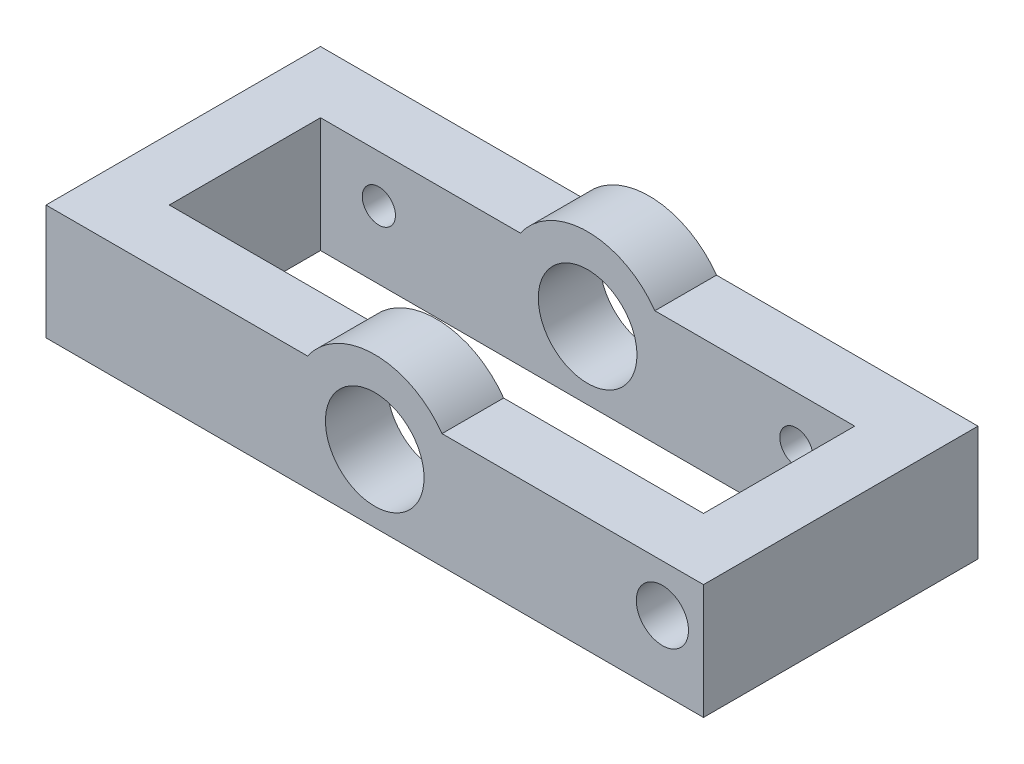
ISO-10303-21;
HEADER;
FILE_DESCRIPTION(('STEP AP214'),'2;1');
FILE_NAME('part.step','',(''),(''),'','','');
FILE_SCHEMA(('AUTOMOTIVE_DESIGN { 1 0 10303 214 1 1 1 1 }'));
ENDSEC;
DATA;
#1=APPLICATION_CONTEXT('core data for automotive mechanical design processes');
#2=APPLICATION_PROTOCOL_DEFINITION('international standard','automotive_design',2000,#1);
#3=PRODUCT_CONTEXT('',#1,'mechanical');
#4=PRODUCT('Part','Part','',(#3));
#5=PRODUCT_RELATED_PRODUCT_CATEGORY('part','',(#4));
#6=PRODUCT_DEFINITION_FORMATION('','',#4);
#7=PRODUCT_DEFINITION_CONTEXT('part definition',#1,'design');
#8=PRODUCT_DEFINITION('design','',#6,#7);
#9=PRODUCT_DEFINITION_SHAPE('','',#8);
#10=(LENGTH_UNIT() NAMED_UNIT(*) SI_UNIT(.MILLI.,.METRE.));
#11=(NAMED_UNIT(*) PLANE_ANGLE_UNIT() SI_UNIT($,.RADIAN.));
#12=(NAMED_UNIT(*) SI_UNIT($,.STERADIAN.) SOLID_ANGLE_UNIT());
#13=UNCERTAINTY_MEASURE_WITH_UNIT(LENGTH_MEASURE(1.E-05),#10,'distance_accuracy_value','');
#14=(GEOMETRIC_REPRESENTATION_CONTEXT(3) GLOBAL_UNCERTAINTY_ASSIGNED_CONTEXT((#13)) GLOBAL_UNIT_ASSIGNED_CONTEXT((#10,
#11,#12)) REPRESENTATION_CONTEXT('',''));
#15=CARTESIAN_POINT('',(0.,0.,0.));
#16=DIRECTION('',(0.,0.,1.));
#17=DIRECTION('',(1.,0.,0.));
#18=AXIS2_PLACEMENT_3D('',#15,#16,#17);
#19=CARTESIAN_POINT('',(-7.50000000000001,7.5,7.50000000000001));
#20=DIRECTION('',(1.,0.,0.));
#21=DIRECTION('',(0.,0.,-1.));
#22=AXIS2_PLACEMENT_3D('',#19,#20,#21);
#23=PLANE('',#22);
#24=DIRECTION('',(0.,0.,-1.));
#25=VECTOR('',#24,1.);
#26=CARTESIAN_POINT('',(-7.50000000000001,-4.5,-25.9));
#27=LINE('',#26,#25);
#28=CARTESIAN_POINT('',(-7.50000000000001,-4.5,7.50000000000001));
#29=VERTEX_POINT('',#28);
#30=CARTESIAN_POINT('',(-7.50000000000001,-4.5,-25.9));
#31=VERTEX_POINT('',#30);
#32=EDGE_CURVE('E189',#29,#31,#27,.T.);
#33=ORIENTED_EDGE('',*,*,#32,.F.);
#34=DIRECTION('',(0.,-1.,0.));
#35=VECTOR('',#34,1.);
#36=CARTESIAN_POINT('',(-7.50000000000001,7.5,7.50000000000001));
#37=LINE('',#36,#35);
#38=CARTESIAN_POINT('',(-7.50000000000001,9.5,7.5));
#39=VERTEX_POINT('',#38);
#40=EDGE_CURVE('E259',#39,#29,#37,.T.);
#41=ORIENTED_EDGE('',*,*,#40,.F.);
#42=DIRECTION('',(0.,0.,1.));
#43=VECTOR('',#42,1.);
#44=CARTESIAN_POINT('',(-7.50000000000001,9.5,7.5));
#45=LINE('',#44,#43);
#46=CARTESIAN_POINT('',(-7.50000000000001,9.5,-25.9));
#47=VERTEX_POINT('',#46);
#48=EDGE_CURVE('E175',#47,#39,#45,.T.);
#49=ORIENTED_EDGE('',*,*,#48,.F.);
#50=DIRECTION('',(0.,-1.,0.));
#51=VECTOR('',#50,1.);
#52=CARTESIAN_POINT('',(-7.50000000000001,7.5,-25.9));
#53=LINE('',#52,#51);
#54=EDGE_CURVE('E262',#47,#31,#53,.T.);
#55=ORIENTED_EDGE('',*,*,#54,.T.);
#56=EDGE_LOOP('',(#33,#41,#49,#55));
#57=FACE_BOUND('',#56,.T.);
#58=ADVANCED_FACE('F35',(#57),#23,.F.);
#59=CARTESIAN_POINT('',(72.5,7.5,7.5));
#60=DIRECTION('',(0.,0.,-1.));
#61=DIRECTION('',(-1.,0.,0.));
#62=AXIS2_PLACEMENT_3D('',#59,#60,#61);
#63=PLANE('',#62);
#64=CARTESIAN_POINT('',(32.5,3.75,7.50000000000001));
#65=DIRECTION('',(0.,0.,1.));
#66=DIRECTION('',(1.,0.,0.));
#67=AXIS2_PLACEMENT_3D('',#64,#65,#66);
#68=CIRCLE('',#67,5.99999999999999);
#69=CARTESIAN_POINT('',(38.5,3.75,7.50000000000001));
#70=VERTEX_POINT('',#69);
#71=EDGE_CURVE('E235',#70,#70,#68,.T.);
#72=ORIENTED_EDGE('',*,*,#71,.F.);
#73=EDGE_LOOP('',(#72));
#74=FACE_BOUND('',#73,.T.);
#75=CARTESIAN_POINT('',(32.5,3.75,7.50000000000001));
#76=DIRECTION('',(0.,0.,1.));
#77=DIRECTION('',(1.,0.,0.));
#78=AXIS2_PLACEMENT_3D('',#75,#76,#77);
#79=CIRCLE('',#78,10.);
#80=CARTESIAN_POINT('',(40.6815340859768,9.5,7.50000000000001));
#81=VERTEX_POINT('',#80);
#82=CARTESIAN_POINT('',(24.3184659140232,9.5,7.50000000000001));
#83=VERTEX_POINT('',#82);
#84=EDGE_CURVE('E53',#81,#83,#79,.T.);
#85=ORIENTED_EDGE('',*,*,#84,.T.);
#86=DIRECTION('',(1.,0.,0.));
#87=VECTOR('',#86,1.);
#88=CARTESIAN_POINT('',(72.5,9.5,7.5));
#89=LINE('',#88,#87);
#90=EDGE_CURVE('E179',#39,#83,#89,.T.);
#91=ORIENTED_EDGE('',*,*,#90,.F.);
#92=ORIENTED_EDGE('',*,*,#40,.T.);
#93=DIRECTION('',(-1.,0.,0.));
#94=VECTOR('',#93,1.);
#95=CARTESIAN_POINT('',(72.5,-4.5,7.50000000000001));
#96=LINE('',#95,#94);
#97=CARTESIAN_POINT('',(72.5,-4.5,7.50000000000001));
#98=VERTEX_POINT('',#97);
#99=EDGE_CURVE('E187',#98,#29,#96,.T.);
#100=ORIENTED_EDGE('',*,*,#99,.F.);
#101=DIRECTION('',(0.,-1.,0.));
#102=VECTOR('',#101,1.);
#103=CARTESIAN_POINT('',(72.5,7.5,7.5));
#104=LINE('',#103,#102);
#105=CARTESIAN_POINT('',(72.5,9.5,7.5));
#106=VERTEX_POINT('',#105);
#107=EDGE_CURVE('E256',#106,#98,#104,.T.);
#108=ORIENTED_EDGE('',*,*,#107,.F.);
#109=EDGE_CURVE('E178',#81,#106,#89,.T.);
#110=ORIENTED_EDGE('',*,*,#109,.F.);
#111=EDGE_LOOP('',(#85,#91,#92,#100,#108,#110));
#112=FACE_BOUND('',#111,.T.);
#113=CARTESIAN_POINT('',(67.5,3.75,7.50000000000001));
#114=DIRECTION('',(0.,0.,-1.));
#115=DIRECTION('',(-1.,0.,0.));
#116=AXIS2_PLACEMENT_3D('',#113,#114,#115);
#117=CIRCLE('',#116,3.175);
#118=CARTESIAN_POINT('',(64.325,3.75,7.50000000000001));
#119=VERTEX_POINT('',#118);
#120=EDGE_CURVE('E203',#119,#119,#117,.T.);
#121=ORIENTED_EDGE('',*,*,#120,.T.);
#122=EDGE_LOOP('',(#121));
#123=FACE_BOUND('',#122,.T.);
#124=ADVANCED_FACE('F287',(#74,#112,#123),#63,.F.);
#125=CARTESIAN_POINT('',(72.5,7.5,-25.9));
#126=DIRECTION('',(-1.,0.,0.));
#127=DIRECTION('',(0.,0.,1.));
#128=AXIS2_PLACEMENT_3D('',#125,#126,#127);
#129=PLANE('',#128);
#130=DIRECTION('',(0.,0.,1.));
#131=VECTOR('',#130,1.);
#132=CARTESIAN_POINT('',(72.5,-4.5,-25.9));
#133=LINE('',#132,#131);
#134=CARTESIAN_POINT('',(72.5,-4.5,-25.9));
#135=VERTEX_POINT('',#134);
#136=EDGE_CURVE('E185',#135,#98,#133,.T.);
#137=ORIENTED_EDGE('',*,*,#136,.F.);
#138=DIRECTION('',(0.,-1.,0.));
#139=VECTOR('',#138,1.);
#140=CARTESIAN_POINT('',(72.5,7.5,-25.9));
#141=LINE('',#140,#139);
#142=CARTESIAN_POINT('',(72.5,9.5,-25.9));
#143=VERTEX_POINT('',#142);
#144=EDGE_CURVE('E253',#143,#135,#141,.T.);
#145=ORIENTED_EDGE('',*,*,#144,.F.);
#146=DIRECTION('',(0.,0.,-1.));
#147=VECTOR('',#146,1.);
#148=CARTESIAN_POINT('',(72.5,9.5,7.5));
#149=LINE('',#148,#147);
#150=EDGE_CURVE('E169',#106,#143,#149,.T.);
#151=ORIENTED_EDGE('',*,*,#150,.F.);
#152=ORIENTED_EDGE('',*,*,#107,.T.);
#153=EDGE_LOOP('',(#137,#145,#151,#152));
#154=FACE_BOUND('',#153,.T.);
#155=ADVANCED_FACE('F295',(#154),#129,.F.);
#156=CARTESIAN_POINT('',(0.,7.5,-25.9));
#157=DIRECTION('',(0.,0.,1.));
#158=DIRECTION('',(1.,0.,0.));
#159=AXIS2_PLACEMENT_3D('',#156,#157,#158);
#160=PLANE('',#159);
#161=CARTESIAN_POINT('',(32.5,3.75,-25.9));
#162=DIRECTION('',(0.,0.,-1.));
#163=DIRECTION('',(-1.,0.,0.));
#164=AXIS2_PLACEMENT_3D('',#161,#162,#163);
#165=CIRCLE('',#164,6.);
#166=CARTESIAN_POINT('',(26.5,3.75,-25.9));
#167=VERTEX_POINT('',#166);
#168=EDGE_CURVE('E218',#167,#167,#165,.T.);
#169=ORIENTED_EDGE('',*,*,#168,.F.);
#170=EDGE_LOOP('',(#169));
#171=FACE_BOUND('',#170,.T.);
#172=CARTESIAN_POINT('',(32.5,3.75,-25.9));
#173=DIRECTION('',(0.,0.,-1.));
#174=DIRECTION('',(-1.,0.,0.));
#175=AXIS2_PLACEMENT_3D('',#172,#173,#174);
#176=CIRCLE('',#175,10.);
#177=CARTESIAN_POINT('',(24.3184659140232,9.5,-25.9));
#178=VERTEX_POINT('',#177);
#179=CARTESIAN_POINT('',(40.6815340859768,9.5,-25.9));
#180=VERTEX_POINT('',#179);
#181=EDGE_CURVE('E230',#178,#180,#176,.T.);
#182=ORIENTED_EDGE('',*,*,#181,.T.);
#183=DIRECTION('',(-1.,0.,0.));
#184=VECTOR('',#183,1.);
#185=CARTESIAN_POINT('',(72.5,9.5,-25.9));
#186=LINE('',#185,#184);
#187=EDGE_CURVE('E173',#143,#180,#186,.T.);
#188=ORIENTED_EDGE('',*,*,#187,.F.);
#189=ORIENTED_EDGE('',*,*,#144,.T.);
#190=DIRECTION('',(1.,0.,0.));
#191=VECTOR('',#190,1.);
#192=CARTESIAN_POINT('',(72.5,-4.5,-25.9));
#193=LINE('',#192,#191);
#194=EDGE_CURVE('E191',#31,#135,#193,.T.);
#195=ORIENTED_EDGE('',*,*,#194,.F.);
#196=ORIENTED_EDGE('',*,*,#54,.F.);
#197=EDGE_CURVE('E172',#178,#47,#186,.T.);
#198=ORIENTED_EDGE('',*,*,#197,.F.);
#199=EDGE_LOOP('',(#182,#188,#189,#195,#196,#198));
#200=FACE_BOUND('',#199,.T.);
#201=CARTESIAN_POINT('',(57.9,3.75,-25.9));
#202=DIRECTION('',(0.,0.,-1.));
#203=DIRECTION('',(-1.,0.,0.));
#204=AXIS2_PLACEMENT_3D('',#201,#202,#203);
#205=CIRCLE('',#204,2.0193);
#206=CARTESIAN_POINT('',(55.8807,3.75,-25.9));
#207=VERTEX_POINT('',#206);
#208=EDGE_CURVE('E222',#207,#207,#205,.T.);
#209=ORIENTED_EDGE('',*,*,#208,.F.);
#210=EDGE_LOOP('',(#209));
#211=FACE_BOUND('',#210,.T.);
#212=CARTESIAN_POINT('',(7.10000000000001,3.75,-25.9));
#213=DIRECTION('',(0.,0.,-1.));
#214=DIRECTION('',(-1.,0.,0.));
#215=AXIS2_PLACEMENT_3D('',#212,#213,#214);
#216=CIRCLE('',#215,2.0193);
#217=CARTESIAN_POINT('',(5.08070000000001,3.75,-25.9));
#218=VERTEX_POINT('',#217);
#219=EDGE_CURVE('E219',#218,#218,#216,.T.);
#220=ORIENTED_EDGE('',*,*,#219,.F.);
#221=EDGE_LOOP('',(#220));
#222=FACE_BOUND('',#221,.T.);
#223=CARTESIAN_POINT('',(67.5,3.75,-25.9));
#224=DIRECTION('',(0.,0.,-1.));
#225=DIRECTION('',(-1.,0.,0.));
#226=AXIS2_PLACEMENT_3D('',#223,#224,#225);
#227=CIRCLE('',#226,3.175);
#228=CARTESIAN_POINT('',(64.325,3.75,-25.9));
#229=VERTEX_POINT('',#228);
#230=EDGE_CURVE('E202',#229,#229,#227,.T.);
#231=ORIENTED_EDGE('',*,*,#230,.F.);
#232=EDGE_LOOP('',(#231));
#233=FACE_BOUND('',#232,.T.);
#234=ADVANCED_FACE('F279',(#171,#200,#211,#222,#233),#160,.F.);
#235=CARTESIAN_POINT('',(0.,7.5,0.));
#236=DIRECTION('',(1.,0.,0.));
#237=DIRECTION('',(0.,0.,-1.));
#238=AXIS2_PLACEMENT_3D('',#235,#236,#237);
#239=PLANE('',#238);
#240=DIRECTION('',(0.,-1.,0.));
#241=VECTOR('',#240,1.);
#242=CARTESIAN_POINT('',(0.,7.5,0.));
#243=LINE('',#242,#241);
#244=CARTESIAN_POINT('',(0.,9.5,0.));
#245=VERTEX_POINT('',#244);
#246=CARTESIAN_POINT('',(0.,-4.5,0.));
#247=VERTEX_POINT('',#246);
#248=EDGE_CURVE('E250',#245,#247,#243,.T.);
#249=ORIENTED_EDGE('',*,*,#248,.T.);
#250=DIRECTION('',(0.,0.,-1.));
#251=VECTOR('',#250,1.);
#252=CARTESIAN_POINT('',(0.,-4.5,0.));
#253=LINE('',#252,#251);
#254=CARTESIAN_POINT('',(0.,-4.5,-18.4));
#255=VERTEX_POINT('',#254);
#256=EDGE_CURVE('E199',#247,#255,#253,.T.);
#257=ORIENTED_EDGE('',*,*,#256,.T.);
#258=DIRECTION('',(0.,-1.,0.));
#259=VECTOR('',#258,1.);
#260=CARTESIAN_POINT('',(0.,7.5,-18.4));
#261=LINE('',#260,#259);
#262=CARTESIAN_POINT('',(0.,9.5,-18.4));
#263=VERTEX_POINT('',#262);
#264=EDGE_CURVE('E245',#263,#255,#261,.T.);
#265=ORIENTED_EDGE('',*,*,#264,.F.);
#266=DIRECTION('',(0.,0.,1.));
#267=VECTOR('',#266,1.);
#268=CARTESIAN_POINT('',(0.,9.5,0.));
#269=LINE('',#268,#267);
#270=EDGE_CURVE('E159',#263,#245,#269,.T.);
#271=ORIENTED_EDGE('',*,*,#270,.T.);
#272=EDGE_LOOP('',(#249,#257,#265,#271));
#273=FACE_BOUND('',#272,.T.);
#274=ADVANCED_FACE('F323',(#273),#239,.T.);
#275=CARTESIAN_POINT('',(0.,7.5,0.));
#276=DIRECTION('',(0.,0.,-1.));
#277=DIRECTION('',(-1.,0.,0.));
#278=AXIS2_PLACEMENT_3D('',#275,#276,#277);
#279=PLANE('',#278);
#280=CARTESIAN_POINT('',(32.5,3.75,0.));
#281=DIRECTION('',(0.,0.,1.));
#282=DIRECTION('',(1.,0.,0.));
#283=AXIS2_PLACEMENT_3D('',#280,#281,#282);
#284=CIRCLE('',#283,5.99999999999999);
#285=CARTESIAN_POINT('',(38.5,3.75,0.));
#286=VERTEX_POINT('',#285);
#287=EDGE_CURVE('E238',#286,#286,#284,.T.);
#288=ORIENTED_EDGE('',*,*,#287,.T.);
#289=EDGE_LOOP('',(#288));
#290=FACE_BOUND('',#289,.T.);
#291=DIRECTION('',(1.,0.,0.));
#292=VECTOR('',#291,1.);
#293=CARTESIAN_POINT('',(65.,9.5,0.));
#294=LINE('',#293,#292);
#295=CARTESIAN_POINT('',(24.3184659140232,9.5,0.));
#296=VERTEX_POINT('',#295);
#297=EDGE_CURVE('E166',#245,#296,#294,.T.);
#298=ORIENTED_EDGE('',*,*,#297,.T.);
#299=CARTESIAN_POINT('',(32.5,3.75,0.));
#300=DIRECTION('',(0.,0.,1.));
#301=DIRECTION('',(1.,0.,0.));
#302=AXIS2_PLACEMENT_3D('',#299,#300,#301);
#303=CIRCLE('',#302,10.);
#304=CARTESIAN_POINT('',(40.6815340859768,9.5,0.));
#305=VERTEX_POINT('',#304);
#306=EDGE_CURVE('E243',#305,#296,#303,.T.);
#307=ORIENTED_EDGE('',*,*,#306,.F.);
#308=CARTESIAN_POINT('',(65.,9.5,0.));
#309=VERTEX_POINT('',#308);
#310=EDGE_CURVE('E162',#305,#309,#294,.T.);
#311=ORIENTED_EDGE('',*,*,#310,.T.);
#312=DIRECTION('',(0.,-1.,0.));
#313=VECTOR('',#312,1.);
#314=CARTESIAN_POINT('',(65.,7.5,0.));
#315=LINE('',#314,#313);
#316=CARTESIAN_POINT('',(65.,5.70719825260499,0.));
#317=VERTEX_POINT('',#316);
#318=EDGE_CURVE('E151',#309,#317,#315,.T.);
#319=ORIENTED_EDGE('',*,*,#318,.T.);
#320=CARTESIAN_POINT('',(67.5,3.75,0.));
#321=DIRECTION('',(0.,0.,-1.));
#322=DIRECTION('',(-1.,0.,0.));
#323=AXIS2_PLACEMENT_3D('',#320,#321,#322);
#324=CIRCLE('',#323,3.175);
#325=CARTESIAN_POINT('',(65.,1.79280174739501,0.));
#326=VERTEX_POINT('',#325);
#327=EDGE_CURVE('E212',#326,#317,#324,.T.);
#328=ORIENTED_EDGE('',*,*,#327,.F.);
#329=CARTESIAN_POINT('',(65.,-4.5,0.));
#330=VERTEX_POINT('',#329);
#331=EDGE_CURVE('E144',#326,#330,#315,.T.);
#332=ORIENTED_EDGE('',*,*,#331,.T.);
#333=DIRECTION('',(-1.,0.,0.));
#334=VECTOR('',#333,1.);
#335=CARTESIAN_POINT('',(0.,-4.5,0.));
#336=LINE('',#335,#334);
#337=EDGE_CURVE('E196',#330,#247,#336,.T.);
#338=ORIENTED_EDGE('',*,*,#337,.T.);
#339=ORIENTED_EDGE('',*,*,#248,.F.);
#340=EDGE_LOOP('',(#298,#307,#311,#319,#328,#332,#338,#339));
#341=FACE_BOUND('',#340,.T.);
#342=ADVANCED_FACE('F327',(#290,#341),#279,.T.);
#343=CARTESIAN_POINT('',(65.,7.5,0.));
#344=DIRECTION('',(-1.,0.,0.));
#345=DIRECTION('',(0.,0.,1.));
#346=AXIS2_PLACEMENT_3D('',#343,#344,#345);
#347=PLANE('',#346);
#348=DIRECTION('',(0.,-1.,0.));
#349=VECTOR('',#348,1.);
#350=CARTESIAN_POINT('',(65.,7.5,-18.4));
#351=LINE('',#350,#349);
#352=CARTESIAN_POINT('',(65.,1.79280174739501,-18.4));
#353=VERTEX_POINT('',#352);
#354=CARTESIAN_POINT('',(65.,-4.5,-18.4));
#355=VERTEX_POINT('',#354);
#356=EDGE_CURVE('E145',#353,#355,#351,.T.);
#357=ORIENTED_EDGE('',*,*,#356,.T.);
#358=DIRECTION('',(0.,0.,1.));
#359=VECTOR('',#358,1.);
#360=CARTESIAN_POINT('',(65.,-4.5,0.));
#361=LINE('',#360,#359);
#362=EDGE_CURVE('E193',#355,#330,#361,.T.);
#363=ORIENTED_EDGE('',*,*,#362,.T.);
#364=ORIENTED_EDGE('',*,*,#331,.F.);
#365=DIRECTION('',(0.,0.,-1.));
#366=VECTOR('',#365,1.);
#367=CARTESIAN_POINT('',(65.,1.79280174739501,7.50000000000001));
#368=LINE('',#367,#366);
#369=EDGE_CURVE('E206',#353,#326,#368,.F.);
#370=ORIENTED_EDGE('',*,*,#369,.F.);
#371=EDGE_LOOP('',(#357,#363,#364,#370));
#372=FACE_BOUND('',#371,.T.);
#373=ADVANCED_FACE('F331',(#372),#347,.T.);
#374=CARTESIAN_POINT('',(0.,7.5,-18.4));
#375=DIRECTION('',(0.,0.,1.));
#376=DIRECTION('',(1.,0.,0.));
#377=AXIS2_PLACEMENT_3D('',#374,#375,#376);
#378=PLANE('',#377);
#379=CARTESIAN_POINT('',(32.5,3.75,-18.4));
#380=DIRECTION('',(0.,0.,-1.));
#381=DIRECTION('',(-1.,0.,0.));
#382=AXIS2_PLACEMENT_3D('',#379,#380,#381);
#383=CIRCLE('',#382,6.);
#384=CARTESIAN_POINT('',(26.5,3.75,-18.4));
#385=VERTEX_POINT('',#384);
#386=EDGE_CURVE('E227',#385,#385,#383,.T.);
#387=ORIENTED_EDGE('',*,*,#386,.T.);
#388=EDGE_LOOP('',(#387));
#389=FACE_BOUND('',#388,.T.);
#390=DIRECTION('',(-1.,0.,0.));
#391=VECTOR('',#390,1.);
#392=CARTESIAN_POINT('',(65.,9.5,-18.4));
#393=LINE('',#392,#391);
#394=CARTESIAN_POINT('',(65.,9.5,-18.4));
#395=VERTEX_POINT('',#394);
#396=CARTESIAN_POINT('',(40.6815340859768,9.5,-18.4));
#397=VERTEX_POINT('',#396);
#398=EDGE_CURVE('E139',#395,#397,#393,.T.);
#399=ORIENTED_EDGE('',*,*,#398,.T.);
#400=CARTESIAN_POINT('',(32.5,3.75,-18.4));
#401=DIRECTION('',(0.,0.,-1.));
#402=DIRECTION('',(-1.,0.,0.));
#403=AXIS2_PLACEMENT_3D('',#400,#401,#402);
#404=CIRCLE('',#403,10.);
#405=CARTESIAN_POINT('',(24.3184659140232,9.5,-18.4));
#406=VERTEX_POINT('',#405);
#407=EDGE_CURVE('E233',#406,#397,#404,.T.);
#408=ORIENTED_EDGE('',*,*,#407,.F.);
#409=EDGE_CURVE('E155',#406,#263,#393,.T.);
#410=ORIENTED_EDGE('',*,*,#409,.T.);
#411=ORIENTED_EDGE('',*,*,#264,.T.);
#412=DIRECTION('',(1.,0.,0.));
#413=VECTOR('',#412,1.);
#414=CARTESIAN_POINT('',(0.,-4.5,-18.4));
#415=LINE('',#414,#413);
#416=EDGE_CURVE('E266',#255,#355,#415,.T.);
#417=ORIENTED_EDGE('',*,*,#416,.T.);
#418=ORIENTED_EDGE('',*,*,#356,.F.);
#419=CARTESIAN_POINT('',(67.5,3.75,-18.4));
#420=DIRECTION('',(0.,0.,1.));
#421=DIRECTION('',(1.,0.,0.));
#422=AXIS2_PLACEMENT_3D('',#419,#420,#421);
#423=CIRCLE('',#422,3.175);
#424=CARTESIAN_POINT('',(65.,5.70719825260499,-18.4));
#425=VERTEX_POINT('',#424);
#426=EDGE_CURVE('E141',#425,#353,#423,.T.);
#427=ORIENTED_EDGE('',*,*,#426,.F.);
#428=EDGE_CURVE('E134',#395,#425,#351,.T.);
#429=ORIENTED_EDGE('',*,*,#428,.F.);
#430=EDGE_LOOP('',(#399,#408,#410,#411,#417,#418,#427,#429));
#431=FACE_BOUND('',#430,.T.);
#432=CARTESIAN_POINT('',(7.10000000000001,3.75,-18.4));
#433=DIRECTION('',(0.,0.,-1.));
#434=DIRECTION('',(-1.,0.,0.));
#435=AXIS2_PLACEMENT_3D('',#432,#433,#434);
#436=CIRCLE('',#435,2.0193);
#437=CARTESIAN_POINT('',(5.08070000000001,3.75,-18.4));
#438=VERTEX_POINT('',#437);
#439=EDGE_CURVE('E215',#438,#438,#436,.T.);
#440=ORIENTED_EDGE('',*,*,#439,.T.);
#441=EDGE_LOOP('',(#440));
#442=FACE_BOUND('',#441,.T.);
#443=CARTESIAN_POINT('',(57.9,3.75,-18.4));
#444=DIRECTION('',(0.,0.,-1.));
#445=DIRECTION('',(-1.,0.,0.));
#446=AXIS2_PLACEMENT_3D('',#443,#444,#445);
#447=CIRCLE('',#446,2.0193);
#448=CARTESIAN_POINT('',(55.8807,3.75,-18.4));
#449=VERTEX_POINT('',#448);
#450=EDGE_CURVE('E214',#449,#449,#447,.T.);
#451=ORIENTED_EDGE('',*,*,#450,.T.);
#452=EDGE_LOOP('',(#451));
#453=FACE_BOUND('',#452,.T.);
#454=ADVANCED_FACE('F136',(#389,#431,#442,#453),#378,.T.);
#455=CARTESIAN_POINT('',(32.5,3.75,0.));
#456=DIRECTION('',(0.,0.,1.));
#457=DIRECTION('',(1.,0.,0.));
#458=AXIS2_PLACEMENT_3D('',#455,#456,#457);
#459=CYLINDRICAL_SURFACE('',#458,5.99999999999999);
#460=ORIENTED_EDGE('',*,*,#287,.F.);
#461=EDGE_LOOP('',(#460));
#462=FACE_BOUND('',#461,.T.);
#463=ORIENTED_EDGE('',*,*,#71,.T.);
#464=EDGE_LOOP('',(#463));
#465=FACE_BOUND('',#464,.T.);
#466=ADVANCED_FACE('F338',(#462,#465),#459,.F.);
#467=CARTESIAN_POINT('',(32.5,3.75,-18.4));
#468=DIRECTION('',(0.,0.,-1.));
#469=DIRECTION('',(-1.,0.,0.));
#470=AXIS2_PLACEMENT_3D('',#467,#468,#469);
#471=CYLINDRICAL_SURFACE('',#470,6.);
#472=ORIENTED_EDGE('',*,*,#168,.T.);
#473=EDGE_LOOP('',(#472));
#474=FACE_BOUND('',#473,.T.);
#475=ORIENTED_EDGE('',*,*,#386,.F.);
#476=EDGE_LOOP('',(#475));
#477=FACE_BOUND('',#476,.T.);
#478=ADVANCED_FACE('F346',(#474,#477),#471,.F.);
#479=DIRECTION('',(0.,0.,-1.));
#480=VECTOR('',#479,1.);
#481=CARTESIAN_POINT('',(65.,5.70719825260499,7.50000000000001));
#482=LINE('',#481,#480);
#483=EDGE_CURVE('E210',#317,#425,#482,.T.);
#484=ORIENTED_EDGE('',*,*,#483,.F.);
#485=ORIENTED_EDGE('',*,*,#318,.F.);
#486=DIRECTION('',(0.,0.,-1.));
#487=VECTOR('',#486,1.);
#488=CARTESIAN_POINT('',(65.,9.5,0.));
#489=LINE('',#488,#487);
#490=EDGE_CURVE('E148',#309,#395,#489,.T.);
#491=ORIENTED_EDGE('',*,*,#490,.T.);
#492=ORIENTED_EDGE('',*,*,#428,.T.);
#493=EDGE_LOOP('',(#484,#485,#491,#492));
#494=FACE_BOUND('',#493,.T.);
#495=ADVANCED_FACE('F149',(#494),#347,.T.);
#496=CARTESIAN_POINT('',(32.5,3.75,0.));
#497=DIRECTION('',(0.,0.,1.));
#498=DIRECTION('',(1.,0.,0.));
#499=AXIS2_PLACEMENT_3D('',#496,#497,#498);
#500=CYLINDRICAL_SURFACE('',#499,10.);
#501=DIRECTION('',(0.,0.,1.));
#502=VECTOR('',#501,1.);
#503=CARTESIAN_POINT('',(24.3184659140232,9.5,0.));
#504=LINE('',#503,#502);
#505=EDGE_CURVE('E49',#83,#296,#504,.F.);
#506=ORIENTED_EDGE('',*,*,#505,.F.);
#507=ORIENTED_EDGE('',*,*,#84,.F.);
#508=DIRECTION('',(0.,0.,1.));
#509=VECTOR('',#508,1.);
#510=CARTESIAN_POINT('',(40.6815340859768,9.5,0.));
#511=LINE('',#510,#509);
#512=EDGE_CURVE('E182',#305,#81,#511,.T.);
#513=ORIENTED_EDGE('',*,*,#512,.F.);
#514=ORIENTED_EDGE('',*,*,#306,.T.);
#515=EDGE_LOOP('',(#506,#507,#513,#514));
#516=FACE_BOUND('',#515,.T.);
#517=ADVANCED_FACE('F340',(#516),#500,.T.);
#518=CARTESIAN_POINT('',(32.5,3.75,-18.4));
#519=DIRECTION('',(0.,0.,-1.));
#520=DIRECTION('',(-1.,0.,0.));
#521=AXIS2_PLACEMENT_3D('',#518,#519,#520);
#522=CYLINDRICAL_SURFACE('',#521,10.);
#523=DIRECTION('',(0.,0.,-1.));
#524=VECTOR('',#523,1.);
#525=CARTESIAN_POINT('',(40.6815340859768,9.5,-18.4));
#526=LINE('',#525,#524);
#527=EDGE_CURVE('E11',#180,#397,#526,.F.);
#528=ORIENTED_EDGE('',*,*,#527,.F.);
#529=ORIENTED_EDGE('',*,*,#181,.F.);
#530=DIRECTION('',(0.,0.,-1.));
#531=VECTOR('',#530,1.);
#532=CARTESIAN_POINT('',(24.3184659140232,9.5,-18.4));
#533=LINE('',#532,#531);
#534=EDGE_CURVE('E42',#406,#178,#533,.T.);
#535=ORIENTED_EDGE('',*,*,#534,.F.);
#536=ORIENTED_EDGE('',*,*,#407,.T.);
#537=EDGE_LOOP('',(#528,#529,#535,#536));
#538=FACE_BOUND('',#537,.T.);
#539=ADVANCED_FACE('F343',(#538),#522,.T.);
#540=CARTESIAN_POINT('',(57.9,3.75,-18.4));
#541=DIRECTION('',(0.,0.,-1.));
#542=DIRECTION('',(-1.,0.,0.));
#543=AXIS2_PLACEMENT_3D('',#540,#541,#542);
#544=CYLINDRICAL_SURFACE('',#543,2.0193);
#545=ORIENTED_EDGE('',*,*,#450,.F.);
#546=EDGE_LOOP('',(#545));
#547=FACE_BOUND('',#546,.T.);
#548=ORIENTED_EDGE('',*,*,#208,.T.);
#549=EDGE_LOOP('',(#548));
#550=FACE_BOUND('',#549,.T.);
#551=ADVANCED_FACE('F350',(#547,#550),#544,.F.);
#552=CARTESIAN_POINT('',(7.10000000000001,3.75,-18.4));
#553=DIRECTION('',(0.,0.,-1.));
#554=DIRECTION('',(-1.,0.,0.));
#555=AXIS2_PLACEMENT_3D('',#552,#553,#554);
#556=CYLINDRICAL_SURFACE('',#555,2.0193);
#557=ORIENTED_EDGE('',*,*,#439,.F.);
#558=EDGE_LOOP('',(#557));
#559=FACE_BOUND('',#558,.T.);
#560=ORIENTED_EDGE('',*,*,#219,.T.);
#561=EDGE_LOOP('',(#560));
#562=FACE_BOUND('',#561,.T.);
#563=ADVANCED_FACE('F307',(#559,#562),#556,.F.);
#564=CARTESIAN_POINT('',(67.5,3.75,7.50000000000001));
#565=DIRECTION('',(0.,0.,-1.));
#566=DIRECTION('',(-1.,0.,0.));
#567=AXIS2_PLACEMENT_3D('',#564,#565,#566);
#568=CYLINDRICAL_SURFACE('',#567,3.175);
#569=ORIENTED_EDGE('',*,*,#327,.T.);
#570=ORIENTED_EDGE('',*,*,#483,.T.);
#571=ORIENTED_EDGE('',*,*,#426,.T.);
#572=ORIENTED_EDGE('',*,*,#369,.T.);
#573=EDGE_LOOP('',(#569,#570,#571,#572));
#574=FACE_BOUND('',#573,.T.);
#575=ORIENTED_EDGE('',*,*,#120,.F.);
#576=EDGE_LOOP('',(#575));
#577=FACE_BOUND('',#576,.T.);
#578=ORIENTED_EDGE('',*,*,#230,.T.);
#579=EDGE_LOOP('',(#578));
#580=FACE_BOUND('',#579,.T.);
#581=ADVANCED_FACE('F299',(#574,#577,#580),#568,.F.);
#582=CARTESIAN_POINT('',(0.,-4.5,0.));
#583=DIRECTION('',(0.,-1.,0.));
#584=DIRECTION('',(0.,0.,-1.));
#585=AXIS2_PLACEMENT_3D('',#582,#583,#584);
#586=PLANE('',#585);
#587=ORIENTED_EDGE('',*,*,#337,.F.);
#588=ORIENTED_EDGE('',*,*,#362,.F.);
#589=ORIENTED_EDGE('',*,*,#416,.F.);
#590=ORIENTED_EDGE('',*,*,#256,.F.);
#591=EDGE_LOOP('',(#587,#588,#589,#590));
#592=FACE_BOUND('',#591,.T.);
#593=ORIENTED_EDGE('',*,*,#136,.T.);
#594=ORIENTED_EDGE('',*,*,#99,.T.);
#595=ORIENTED_EDGE('',*,*,#32,.T.);
#596=ORIENTED_EDGE('',*,*,#194,.T.);
#597=EDGE_LOOP('',(#593,#594,#595,#596));
#598=FACE_BOUND('',#597,.T.);
#599=ADVANCED_FACE('F297',(#592,#598),#586,.T.);
#600=CARTESIAN_POINT('',(0.,9.5,0.));
#601=DIRECTION('',(0.,1.,0.));
#602=DIRECTION('',(0.,0.,1.));
#603=AXIS2_PLACEMENT_3D('',#600,#601,#602);
#604=PLANE('',#603);
#605=ORIENTED_EDGE('',*,*,#310,.F.);
#606=ORIENTED_EDGE('',*,*,#512,.T.);
#607=ORIENTED_EDGE('',*,*,#109,.T.);
#608=ORIENTED_EDGE('',*,*,#150,.T.);
#609=ORIENTED_EDGE('',*,*,#187,.T.);
#610=ORIENTED_EDGE('',*,*,#527,.T.);
#611=ORIENTED_EDGE('',*,*,#398,.F.);
#612=ORIENTED_EDGE('',*,*,#490,.F.);
#613=EDGE_LOOP('',(#605,#606,#607,#608,#609,#610,#611,#612));
#614=FACE_BOUND('',#613,.T.);
#615=ADVANCED_FACE('F157',(#614),#604,.T.);
#616=ORIENTED_EDGE('',*,*,#90,.T.);
#617=ORIENTED_EDGE('',*,*,#505,.T.);
#618=ORIENTED_EDGE('',*,*,#297,.F.);
#619=ORIENTED_EDGE('',*,*,#270,.F.);
#620=ORIENTED_EDGE('',*,*,#409,.F.);
#621=ORIENTED_EDGE('',*,*,#534,.T.);
#622=ORIENTED_EDGE('',*,*,#197,.T.);
#623=ORIENTED_EDGE('',*,*,#48,.T.);
#624=EDGE_LOOP('',(#616,#617,#618,#619,#620,#621,#622,#623));
#625=FACE_BOUND('',#624,.T.);
#626=ADVANCED_FACE('F274',(#625),#604,.T.);
#627=CLOSED_SHELL('',(#58,#124,#155,#234,#274,#342,#373,#454,#466,#478,#495,#517,#539,#551,#563,
#581,#599,#615,#626));
#628=MANIFOLD_SOLID_BREP('B2',#627);
#629=ADVANCED_BREP_SHAPE_REPRESENTATION('',(#18,#628),#14);
#630=SHAPE_DEFINITION_REPRESENTATION(#9,#629);
ENDSEC;
END-ISO-10303-21;
